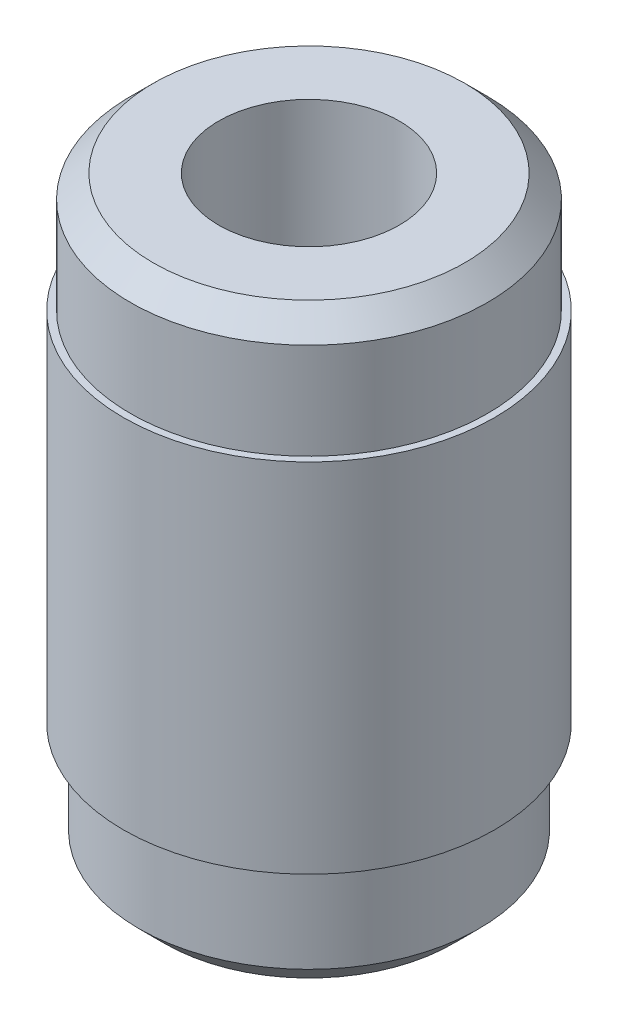
ISO-10303-21;
HEADER;
FILE_DESCRIPTION(('STEP AP214'),'2;1');
FILE_NAME('part.step','',(''),(''),'','','');
FILE_SCHEMA(('AUTOMOTIVE_DESIGN { 1 0 10303 214 1 1 1 1 }'));
ENDSEC;
DATA;
#1=APPLICATION_CONTEXT('core data for automotive mechanical design processes');
#2=APPLICATION_PROTOCOL_DEFINITION('international standard','automotive_design',2000,#1);
#3=PRODUCT_CONTEXT('',#1,'mechanical');
#4=PRODUCT('Part','Part','',(#3));
#5=PRODUCT_RELATED_PRODUCT_CATEGORY('part','',(#4));
#6=PRODUCT_DEFINITION_FORMATION('','',#4);
#7=PRODUCT_DEFINITION_CONTEXT('part definition',#1,'design');
#8=PRODUCT_DEFINITION('design','',#6,#7);
#9=PRODUCT_DEFINITION_SHAPE('','',#8);
#10=(LENGTH_UNIT() NAMED_UNIT(*) SI_UNIT(.MILLI.,.METRE.));
#11=(NAMED_UNIT(*) PLANE_ANGLE_UNIT() SI_UNIT($,.RADIAN.));
#12=(NAMED_UNIT(*) SI_UNIT($,.STERADIAN.) SOLID_ANGLE_UNIT());
#13=UNCERTAINTY_MEASURE_WITH_UNIT(LENGTH_MEASURE(1.E-05),#10,'distance_accuracy_value','');
#14=(GEOMETRIC_REPRESENTATION_CONTEXT(3) GLOBAL_UNCERTAINTY_ASSIGNED_CONTEXT((#13)) GLOBAL_UNIT_ASSIGNED_CONTEXT((#10,
#11,#12)) REPRESENTATION_CONTEXT('',''));
#15=CARTESIAN_POINT('',(0.,0.,0.));
#16=DIRECTION('',(0.,0.,1.));
#17=DIRECTION('',(1.,0.,0.));
#18=AXIS2_PLACEMENT_3D('',#15,#16,#17);
#19=CARTESIAN_POINT('',(19.5594405594406,0.,0.));
#20=DIRECTION('',(0.,1.,0.));
#21=DIRECTION('',(0.,0.,1.));
#22=AXIS2_PLACEMENT_3D('',#19,#20,#21);
#23=PLANE('',#22);
#24=CARTESIAN_POINT('',(27.147636199382,0.,0.));
#25=DIRECTION('',(0.,1.,0.));
#26=DIRECTION('',(0.,0.,1.));
#27=AXIS2_PLACEMENT_3D('',#24,#25,#26);
#28=CIRCLE('',#27,7.5881956399414);
#29=CARTESIAN_POINT('',(27.147636199382,0.,7.5881956399414));
#30=VERTEX_POINT('',#29);
#31=EDGE_CURVE('E10',#30,#30,#28,.T.);
#32=ORIENTED_EDGE('',*,*,#31,.T.);
#33=EDGE_LOOP('',(#32));
#34=FACE_BOUND('',#33,.T.);
#35=CARTESIAN_POINT('',(27.147636199382,0.,0.));
#36=DIRECTION('',(0.,1.,0.));
#37=DIRECTION('',(0.,0.,1.));
#38=AXIS2_PLACEMENT_3D('',#35,#36,#37);
#39=CIRCLE('',#38,12.12723);
#40=CARTESIAN_POINT('',(27.147636199382,0.,12.12723));
#41=VERTEX_POINT('',#40);
#42=EDGE_CURVE('E71',#41,#41,#39,.T.);
#43=ORIENTED_EDGE('',*,*,#42,.F.);
#44=EDGE_LOOP('',(#43));
#45=FACE_BOUND('',#44,.T.);
#46=ADVANCED_FACE('F41',(#34,#45),#23,.F.);
#47=CARTESIAN_POINT('',(11.5594405594406,50.,0.));
#48=DIRECTION('',(0.,-1.,0.));
#49=DIRECTION('',(0.,0.,-1.));
#50=AXIS2_PLACEMENT_3D('',#47,#48,#49);
#51=PLANE('',#50);
#52=CARTESIAN_POINT('',(27.147636199382,50.,0.));
#53=DIRECTION('',(0.,1.,0.));
#54=DIRECTION('',(0.,0.,1.));
#55=AXIS2_PLACEMENT_3D('',#52,#53,#54);
#56=CIRCLE('',#55,7.5881956399414);
#57=CARTESIAN_POINT('',(27.147636199382,50.,7.5881956399414));
#58=VERTEX_POINT('',#57);
#59=EDGE_CURVE('E48',#58,#58,#56,.T.);
#60=ORIENTED_EDGE('',*,*,#59,.F.);
#61=EDGE_LOOP('',(#60));
#62=FACE_BOUND('',#61,.T.);
#63=CARTESIAN_POINT('',(27.147636199382,50.,0.));
#64=DIRECTION('',(0.,-1.,0.));
#65=DIRECTION('',(0.,0.,-1.));
#66=AXIS2_PLACEMENT_3D('',#63,#64,#65);
#67=CIRCLE('',#66,13.079);
#68=CARTESIAN_POINT('',(27.147636199382,50.,-13.079));
#69=VERTEX_POINT('',#68);
#70=EDGE_CURVE('E62',#69,#69,#67,.T.);
#71=ORIENTED_EDGE('',*,*,#70,.F.);
#72=EDGE_LOOP('',(#71));
#73=FACE_BOUND('',#72,.T.);
#74=ADVANCED_FACE('F89',(#62,#73),#51,.F.);
#75=CARTESIAN_POINT('',(27.147636199382,50.,0.));
#76=DIRECTION('',(0.,1.,0.));
#77=DIRECTION('',(0.,0.,1.));
#78=AXIS2_PLACEMENT_3D('',#75,#76,#77);
#79=CYLINDRICAL_SURFACE('',#78,7.5881956399414);
#80=ORIENTED_EDGE('',*,*,#59,.T.);
#81=EDGE_LOOP('',(#80));
#82=FACE_BOUND('',#81,.T.);
#83=ORIENTED_EDGE('',*,*,#31,.F.);
#84=EDGE_LOOP('',(#83));
#85=FACE_BOUND('',#84,.T.);
#86=ADVANCED_FACE('F43',(#82,#85),#79,.F.);
#87=CARTESIAN_POINT('',(27.147636199382,50.,0.));
#88=DIRECTION('',(0.,1.,0.));
#89=DIRECTION('',(0.,0.,1.));
#90=AXIS2_PLACEMENT_3D('',#87,#88,#89);
#91=CYLINDRICAL_SURFACE('',#90,15.5881956399414);
#92=CARTESIAN_POINT('',(27.147636199382,10.,0.));
#93=DIRECTION('',(0.,1.,0.));
#94=DIRECTION('',(0.,0.,1.));
#95=AXIS2_PLACEMENT_3D('',#92,#93,#94);
#96=CIRCLE('',#95,15.5881956399414);
#97=CARTESIAN_POINT('',(27.147636199382,10.,15.5881956399414));
#98=VERTEX_POINT('',#97);
#99=EDGE_CURVE('E69',#98,#98,#96,.T.);
#100=ORIENTED_EDGE('',*,*,#99,.T.);
#101=EDGE_LOOP('',(#100));
#102=FACE_BOUND('',#101,.T.);
#103=CARTESIAN_POINT('',(27.147636199382,40.,0.));
#104=DIRECTION('',(0.,-1.,0.));
#105=DIRECTION('',(0.,0.,-1.));
#106=AXIS2_PLACEMENT_3D('',#103,#104,#105);
#107=CIRCLE('',#106,15.5881956399414);
#108=CARTESIAN_POINT('',(27.147636199382,40.,-15.5881956399414));
#109=VERTEX_POINT('',#108);
#110=EDGE_CURVE('E57',#109,#109,#107,.T.);
#111=ORIENTED_EDGE('',*,*,#110,.T.);
#112=EDGE_LOOP('',(#111));
#113=FACE_BOUND('',#112,.T.);
#114=ADVANCED_FACE('F97',(#102,#113),#91,.T.);
#115=CARTESIAN_POINT('',(27.147636199382,50.,0.));
#116=DIRECTION('',(0.,-1.,0.));
#117=DIRECTION('',(0.,0.,-1.));
#118=AXIS2_PLACEMENT_3D('',#115,#116,#117);
#119=CYLINDRICAL_SURFACE('',#118,15.);
#120=CARTESIAN_POINT('',(27.147636199382,40.,0.));
#121=DIRECTION('',(0.,-1.,0.));
#122=DIRECTION('',(0.,0.,-1.));
#123=AXIS2_PLACEMENT_3D('',#120,#121,#122);
#124=CIRCLE('',#123,15.);
#125=CARTESIAN_POINT('',(27.147636199382,40.,-15.));
#126=VERTEX_POINT('',#125);
#127=EDGE_CURVE('E55',#126,#126,#124,.T.);
#128=ORIENTED_EDGE('',*,*,#127,.F.);
#129=EDGE_LOOP('',(#128));
#130=FACE_BOUND('',#129,.T.);
#131=CARTESIAN_POINT('',(27.147636199382,48.079,0.));
#132=DIRECTION('',(0.,-1.,0.));
#133=DIRECTION('',(0.,0.,-1.));
#134=AXIS2_PLACEMENT_3D('',#131,#132,#133);
#135=CIRCLE('',#134,15.);
#136=CARTESIAN_POINT('',(27.147636199382,48.079,-15.));
#137=VERTEX_POINT('',#136);
#138=EDGE_CURVE('E61',#137,#137,#135,.T.);
#139=ORIENTED_EDGE('',*,*,#138,.T.);
#140=EDGE_LOOP('',(#139));
#141=FACE_BOUND('',#140,.T.);
#142=ADVANCED_FACE('F99',(#130,#141),#119,.T.);
#143=CARTESIAN_POINT('',(42.147636199382,40.,0.));
#144=DIRECTION('',(0.,-1.,0.));
#145=DIRECTION('',(0.,0.,-1.));
#146=AXIS2_PLACEMENT_3D('',#143,#144,#145);
#147=PLANE('',#146);
#148=ORIENTED_EDGE('',*,*,#110,.F.);
#149=EDGE_LOOP('',(#148));
#150=FACE_BOUND('',#149,.T.);
#151=ORIENTED_EDGE('',*,*,#127,.T.);
#152=EDGE_LOOP('',(#151));
#153=FACE_BOUND('',#152,.T.);
#154=ADVANCED_FACE('F104',(#150,#153),#147,.F.);
#155=CARTESIAN_POINT('',(27.147636199382,50.,0.));
#156=DIRECTION('',(0.,-1.,0.));
#157=DIRECTION('',(0.,0.,-1.));
#158=AXIS2_PLACEMENT_3D('',#155,#156,#157);
#159=CONICAL_SURFACE('',#158,13.079,0.785398163397455);
#160=ORIENTED_EDGE('',*,*,#138,.F.);
#161=EDGE_LOOP('',(#160));
#162=FACE_BOUND('',#161,.T.);
#163=ORIENTED_EDGE('',*,*,#70,.T.);
#164=EDGE_LOOP('',(#163));
#165=FACE_BOUND('',#164,.T.);
#166=ADVANCED_FACE('F108',(#162,#165),#159,.T.);
#167=CARTESIAN_POINT('',(27.147636199382,0.,0.));
#168=DIRECTION('',(0.,1.,0.));
#169=DIRECTION('',(0.,0.,1.));
#170=AXIS2_PLACEMENT_3D('',#167,#168,#169);
#171=CYLINDRICAL_SURFACE('',#170,14.2875);
#172=CARTESIAN_POINT('',(27.147636199382,10.,0.));
#173=DIRECTION('',(0.,1.,0.));
#174=DIRECTION('',(0.,0.,1.));
#175=AXIS2_PLACEMENT_3D('',#172,#173,#174);
#176=CIRCLE('',#175,14.2875);
#177=CARTESIAN_POINT('',(27.147636199382,10.,14.2875));
#178=VERTEX_POINT('',#177);
#179=EDGE_CURVE('E70',#178,#178,#176,.T.);
#180=ORIENTED_EDGE('',*,*,#179,.F.);
#181=EDGE_LOOP('',(#180));
#182=FACE_BOUND('',#181,.T.);
#183=CARTESIAN_POINT('',(27.147636199382,2.16027,0.));
#184=DIRECTION('',(0.,1.,0.));
#185=DIRECTION('',(0.,0.,1.));
#186=AXIS2_PLACEMENT_3D('',#183,#184,#185);
#187=CIRCLE('',#186,14.2875);
#188=CARTESIAN_POINT('',(27.147636199382,2.16027,14.2875));
#189=VERTEX_POINT('',#188);
#190=EDGE_CURVE('E77',#189,#189,#187,.T.);
#191=ORIENTED_EDGE('',*,*,#190,.T.);
#192=EDGE_LOOP('',(#191));
#193=FACE_BOUND('',#192,.T.);
#194=ADVANCED_FACE('F78',(#182,#193),#171,.T.);
#195=CARTESIAN_POINT('',(41.435136199382,10.,0.));
#196=DIRECTION('',(0.,1.,0.));
#197=DIRECTION('',(0.,0.,1.));
#198=AXIS2_PLACEMENT_3D('',#195,#196,#197);
#199=PLANE('',#198);
#200=ORIENTED_EDGE('',*,*,#99,.F.);
#201=EDGE_LOOP('',(#200));
#202=FACE_BOUND('',#201,.T.);
#203=ORIENTED_EDGE('',*,*,#179,.T.);
#204=EDGE_LOOP('',(#203));
#205=FACE_BOUND('',#204,.T.);
#206=ADVANCED_FACE('F84',(#202,#205),#199,.F.);
#207=CARTESIAN_POINT('',(27.147636199382,0.,0.));
#208=DIRECTION('',(0.,1.,0.));
#209=DIRECTION('',(0.,0.,1.));
#210=AXIS2_PLACEMENT_3D('',#207,#208,#209);
#211=CONICAL_SURFACE('',#210,12.12723,0.785398163397447);
#212=ORIENTED_EDGE('',*,*,#190,.F.);
#213=EDGE_LOOP('',(#212));
#214=FACE_BOUND('',#213,.T.);
#215=ORIENTED_EDGE('',*,*,#42,.T.);
#216=EDGE_LOOP('',(#215));
#217=FACE_BOUND('',#216,.T.);
#218=ADVANCED_FACE('F85',(#214,#217),#211,.T.);
#219=CLOSED_SHELL('',(#46,#74,#86,#114,#142,#154,#166,#194,#206,#218));
#220=MANIFOLD_SOLID_BREP('B2',#219);
#221=ADVANCED_BREP_SHAPE_REPRESENTATION('',(#18,#220),#14);
#222=SHAPE_DEFINITION_REPRESENTATION(#9,#221);
ENDSEC;
END-ISO-10303-21;
